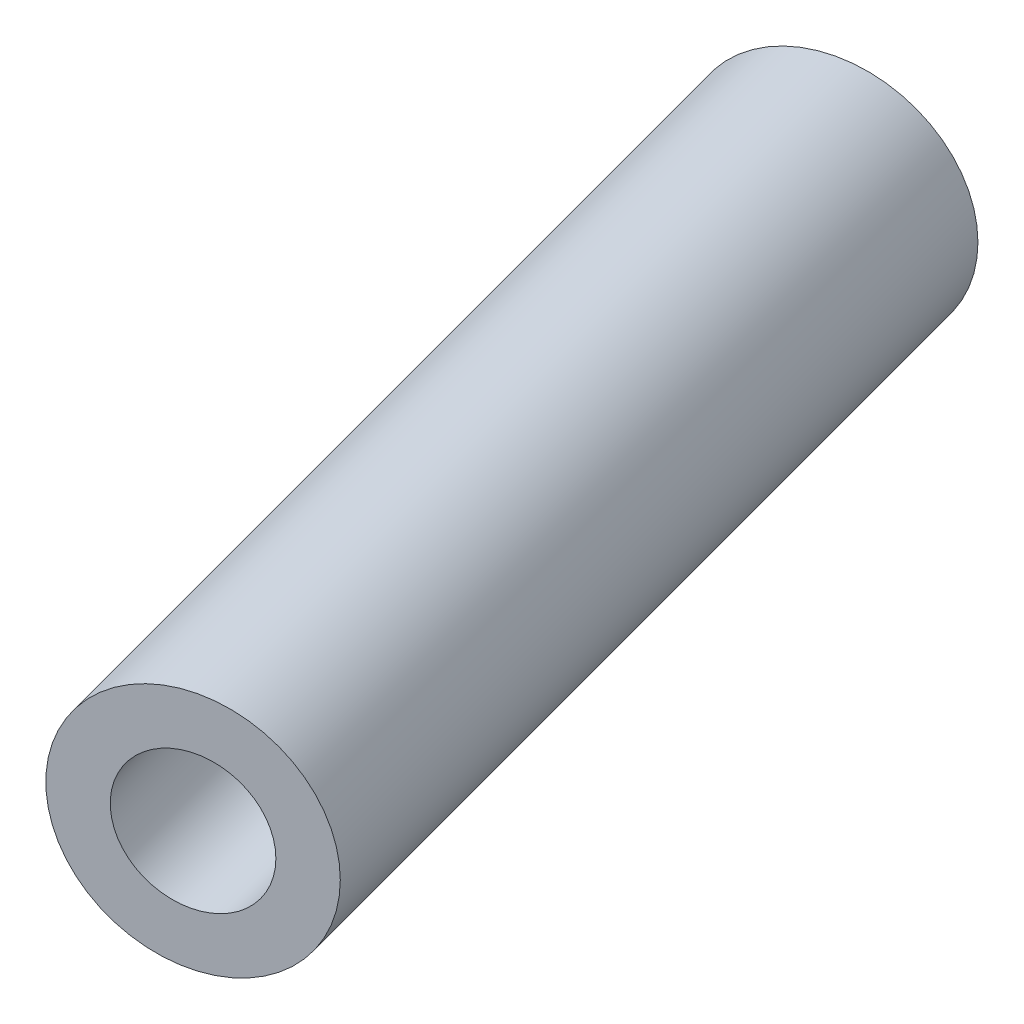
ISO-10303-21;
HEADER;
FILE_DESCRIPTION(('STEP AP214'),'2;1');
FILE_NAME('part.step','',(''),(''),'','','');
FILE_SCHEMA(('AUTOMOTIVE_DESIGN { 1 0 10303 214 1 1 1 1 }'));
ENDSEC;
DATA;
#1=APPLICATION_CONTEXT('core data for automotive mechanical design processes');
#2=APPLICATION_PROTOCOL_DEFINITION('international standard','automotive_design',2000,#1);
#3=PRODUCT_CONTEXT('',#1,'mechanical');
#4=PRODUCT('Part','Part','',(#3));
#5=PRODUCT_RELATED_PRODUCT_CATEGORY('part','',(#4));
#6=PRODUCT_DEFINITION_FORMATION('','',#4);
#7=PRODUCT_DEFINITION_CONTEXT('part definition',#1,'design');
#8=PRODUCT_DEFINITION('design','',#6,#7);
#9=PRODUCT_DEFINITION_SHAPE('','',#8);
#10=(LENGTH_UNIT() NAMED_UNIT(*) SI_UNIT(.MILLI.,.METRE.));
#11=(NAMED_UNIT(*) PLANE_ANGLE_UNIT() SI_UNIT($,.RADIAN.));
#12=(NAMED_UNIT(*) SI_UNIT($,.STERADIAN.) SOLID_ANGLE_UNIT());
#13=UNCERTAINTY_MEASURE_WITH_UNIT(LENGTH_MEASURE(1.E-05),#10,'distance_accuracy_value','');
#14=(GEOMETRIC_REPRESENTATION_CONTEXT(3) GLOBAL_UNCERTAINTY_ASSIGNED_CONTEXT((#13)) GLOBAL_UNIT_ASSIGNED_CONTEXT((#10,
#11,#12)) REPRESENTATION_CONTEXT('',''));
#15=CARTESIAN_POINT('',(0.,0.,0.));
#16=DIRECTION('',(0.,0.,1.));
#17=DIRECTION('',(1.,0.,0.));
#18=AXIS2_PLACEMENT_3D('',#15,#16,#17);
#19=CARTESIAN_POINT('',(121.74118095489,0.,1962.946813077));
#20=DIRECTION('',(0.258819045102985,0.,0.965925826288944));
#21=DIRECTION('',(0.965925826288944,0.,-0.258819045102985));
#22=AXIS2_PLACEMENT_3D('',#19,#20,#21);
#23=CYLINDRICAL_SURFACE('',#22,4.5);
#24=DIRECTION('',(0.258819045102985,0.,0.965925826288944));
#25=VECTOR('',#24,1.);
#26=CARTESIAN_POINT('',(126.08784717319,0.,1961.782127374));
#27=LINE('',#26,#25);
#28=CARTESIAN_POINT('',(126.3466662183,0.,1962.7480532));
#29=VERTEX_POINT('',#28);
#30=CARTESIAN_POINT('',(141.87580892445,0.,2020.703602777));
#31=VERTEX_POINT('',#30);
#32=EDGE_CURVE('E11',#29,#31,#27,.T.);
#33=ORIENTED_EDGE('',*,*,#32,.F.);
#34=CARTESIAN_POINT('',(122.,0.,1963.912738903));
#35=DIRECTION('',(0.258819045102985,0.,0.965925826288944));
#36=DIRECTION('',(0.965925826288944,0.,-0.258819045102985));
#37=AXIS2_PLACEMENT_3D('',#34,#35,#36);
#38=CIRCLE('',#37,4.5);
#39=EDGE_CURVE('E26',#29,#29,#38,.T.);
#40=ORIENTED_EDGE('',*,*,#39,.F.);
#41=ORIENTED_EDGE('',*,*,#32,.T.);
#42=CARTESIAN_POINT('',(137.52914270615,0.,2021.86828848));
#43=DIRECTION('',(0.258819045102985,0.,0.965925826288944));
#44=DIRECTION('',(0.965925826288944,0.,-0.258819045102985));
#45=AXIS2_PLACEMENT_3D('',#42,#43,#44);
#46=CIRCLE('',#45,4.5);
#47=EDGE_CURVE('E20',#31,#31,#46,.T.);
#48=ORIENTED_EDGE('',*,*,#47,.T.);
#49=EDGE_LOOP('',(#33,#40,#41,#48));
#50=FACE_BOUND('',#49,.T.);
#51=ADVANCED_FACE('F17',(#50),#23,.F.);
#52=CARTESIAN_POINT('',(122.,0.,1963.912738903));
#53=DIRECTION('',(0.258819045102985,0.,0.965925826288944));
#54=DIRECTION('',(0.,-1.,0.));
#55=AXIS2_PLACEMENT_3D('',#52,#53,#54);
#56=PLANE('',#55);
#57=ORIENTED_EDGE('',*,*,#39,.T.);
#58=EDGE_LOOP('',(#57));
#59=FACE_BOUND('',#58,.T.);
#60=CARTESIAN_POINT('',(122.,0.,1963.912738903));
#61=DIRECTION('',(0.258819045102985,0.,0.965925826288944));
#62=DIRECTION('',(0.965925826288944,0.,-0.258819045102985));
#63=AXIS2_PLACEMENT_3D('',#60,#61,#62);
#64=CIRCLE('',#63,8.);
#65=CARTESIAN_POINT('',(129.72740661031,0.,1961.842186542));
#66=VERTEX_POINT('',#65);
#67=EDGE_CURVE('E58',#66,#66,#64,.T.);
#68=ORIENTED_EDGE('',*,*,#67,.F.);
#69=EDGE_LOOP('',(#68));
#70=FACE_BOUND('',#69,.T.);
#71=ADVANCED_FACE('F81',(#59,#70),#56,.F.);
#72=CARTESIAN_POINT('',(137.52914270615,0.,2021.86828848));
#73=DIRECTION('',(0.258819045102985,0.,0.965925826288944));
#74=DIRECTION('',(0.,-1.,0.));
#75=AXIS2_PLACEMENT_3D('',#72,#73,#74);
#76=PLANE('',#75);
#77=ORIENTED_EDGE('',*,*,#47,.F.);
#78=EDGE_LOOP('',(#77));
#79=FACE_BOUND('',#78,.T.);
#80=CARTESIAN_POINT('',(137.52914270615,0.,2021.86828848));
#81=DIRECTION('',(0.258819045102985,0.,0.965925826288944));
#82=DIRECTION('',(0.965925826288944,0.,-0.258819045102985));
#83=AXIS2_PLACEMENT_3D('',#80,#81,#82);
#84=CIRCLE('',#83,8.);
#85=CARTESIAN_POINT('',(145.25654931646,0.,2019.797736119));
#86=VERTEX_POINT('',#85);
#87=EDGE_CURVE('E56',#86,#86,#84,.T.);
#88=ORIENTED_EDGE('',*,*,#87,.T.);
#89=EDGE_LOOP('',(#88));
#90=FACE_BOUND('',#89,.T.);
#91=ADVANCED_FACE('F62',(#79,#90),#76,.T.);
#92=CARTESIAN_POINT('',(122.,0.,1963.912738903));
#93=DIRECTION('',(0.258819045102985,0.,0.965925826288944));
#94=DIRECTION('',(0.965925826288944,0.,-0.258819045102985));
#95=AXIS2_PLACEMENT_3D('',#92,#93,#94);
#96=CYLINDRICAL_SURFACE('',#95,8.);
#97=ORIENTED_EDGE('',*,*,#87,.F.);
#98=DIRECTION('',(0.258819045102985,0.,0.965925826288944));
#99=VECTOR('',#98,1.);
#100=CARTESIAN_POINT('',(129.72740661031,0.,1961.842186542));
#101=LINE('',#100,#99);
#102=EDGE_CURVE('E53',#66,#86,#101,.T.);
#103=ORIENTED_EDGE('',*,*,#102,.F.);
#104=ORIENTED_EDGE('',*,*,#67,.T.);
#105=ORIENTED_EDGE('',*,*,#102,.T.);
#106=EDGE_LOOP('',(#97,#103,#104,#105));
#107=FACE_BOUND('',#106,.T.);
#108=ADVANCED_FACE('F55',(#107),#96,.T.);
#109=CLOSED_SHELL('',(#51,#71,#91,#108));
#110=MANIFOLD_SOLID_BREP('B1',#109);
#111=ADVANCED_BREP_SHAPE_REPRESENTATION('',(#18,#110),#14);
#112=SHAPE_DEFINITION_REPRESENTATION(#9,#111);
ENDSEC;
END-ISO-10303-21;
